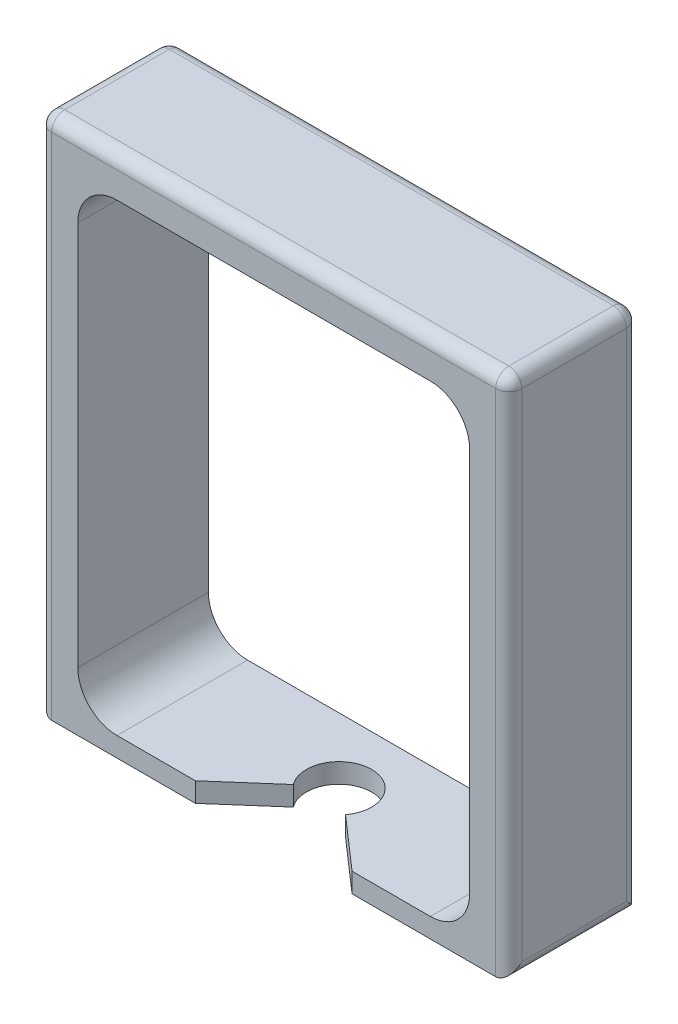
ISO-10303-21;
HEADER;
FILE_DESCRIPTION(('STEP AP214'),'2;1');
FILE_NAME('part.step','',(''),(''),'','','');
FILE_SCHEMA(('AUTOMOTIVE_DESIGN { 1 0 10303 214 1 1 1 1 }'));
ENDSEC;
DATA;
#1=APPLICATION_CONTEXT('core data for automotive mechanical design processes');
#2=APPLICATION_PROTOCOL_DEFINITION('international standard','automotive_design',2000,#1);
#3=PRODUCT_CONTEXT('',#1,'mechanical');
#4=PRODUCT('Part','Part','',(#3));
#5=PRODUCT_RELATED_PRODUCT_CATEGORY('part','',(#4));
#6=PRODUCT_DEFINITION_FORMATION('','',#4);
#7=PRODUCT_DEFINITION_CONTEXT('part definition',#1,'design');
#8=PRODUCT_DEFINITION('design','',#6,#7);
#9=PRODUCT_DEFINITION_SHAPE('','',#8);
#10=(LENGTH_UNIT() NAMED_UNIT(*) SI_UNIT(.MILLI.,.METRE.));
#11=(NAMED_UNIT(*) PLANE_ANGLE_UNIT() SI_UNIT($,.RADIAN.));
#12=(NAMED_UNIT(*) SI_UNIT($,.STERADIAN.) SOLID_ANGLE_UNIT());
#13=UNCERTAINTY_MEASURE_WITH_UNIT(LENGTH_MEASURE(1.E-05),#10,'distance_accuracy_value','');
#14=(GEOMETRIC_REPRESENTATION_CONTEXT(3) GLOBAL_UNCERTAINTY_ASSIGNED_CONTEXT((#13)) GLOBAL_UNIT_ASSIGNED_CONTEXT((#10,
#11,#12)) REPRESENTATION_CONTEXT('',''));
#15=CARTESIAN_POINT('',(0.,0.,0.));
#16=DIRECTION('',(0.,0.,1.));
#17=DIRECTION('',(1.,0.,0.));
#18=AXIS2_PLACEMENT_3D('',#15,#16,#17);
#19=CARTESIAN_POINT('',(0.,0.,10.));
#20=DIRECTION('',(0.,0.,1.));
#21=DIRECTION('',(1.,0.,0.));
#22=AXIS2_PLACEMENT_3D('',#19,#20,#21);
#23=PLANE('',#22);
#24=DIRECTION('',(1.,0.,0.));
#25=VECTOR('',#24,1.);
#26=CARTESIAN_POINT('',(-18.,-20.,10.));
#27=LINE('',#26,#25);
#28=CARTESIAN_POINT('',(6.,-20.,10.));
#29=VERTEX_POINT('',#28);
#30=CARTESIAN_POINT('',(17.,-20.,10.));
#31=VERTEX_POINT('',#30);
#32=EDGE_CURVE('E201',#29,#31,#27,.T.);
#33=ORIENTED_EDGE('',*,*,#32,.T.);
#34=DIRECTION('',(0.,1.,0.));
#35=VECTOR('',#34,1.);
#36=CARTESIAN_POINT('',(17.,20.,10.));
#37=LINE('',#36,#35);
#38=CARTESIAN_POINT('',(17.,19.,10.));
#39=VERTEX_POINT('',#38);
#40=EDGE_CURVE('E284',#31,#39,#37,.T.);
#41=ORIENTED_EDGE('',*,*,#40,.T.);
#42=DIRECTION('',(-1.,0.,0.));
#43=VECTOR('',#42,1.);
#44=CARTESIAN_POINT('',(-18.,19.,10.));
#45=LINE('',#44,#43);
#46=CARTESIAN_POINT('',(-17.,19.,10.));
#47=VERTEX_POINT('',#46);
#48=EDGE_CURVE('E280',#39,#47,#45,.T.);
#49=ORIENTED_EDGE('',*,*,#48,.T.);
#50=DIRECTION('',(0.,-1.,0.));
#51=VECTOR('',#50,1.);
#52=CARTESIAN_POINT('',(-17.,-20.,10.));
#53=LINE('',#52,#51);
#54=CARTESIAN_POINT('',(-17.,-20.,10.));
#55=VERTEX_POINT('',#54);
#56=EDGE_CURVE('E282',#47,#55,#53,.T.);
#57=ORIENTED_EDGE('',*,*,#56,.T.);
#58=CARTESIAN_POINT('',(-6.,-20.,10.));
#59=VERTEX_POINT('',#58);
#60=EDGE_CURVE('E213',#55,#59,#27,.T.);
#61=ORIENTED_EDGE('',*,*,#60,.T.);
#62=DIRECTION('',(0.,-1.,0.));
#63=VECTOR('',#62,1.);
#64=CARTESIAN_POINT('',(-6.,20.001,10.));
#65=LINE('',#64,#63);
#66=CARTESIAN_POINT('',(-6.,-18.5,10.));
#67=VERTEX_POINT('',#66);
#68=EDGE_CURVE('E339',#67,#59,#65,.T.);
#69=ORIENTED_EDGE('',*,*,#68,.F.);
#70=DIRECTION('',(1.,0.,0.));
#71=VECTOR('',#70,1.);
#72=CARTESIAN_POINT('',(-15.,-18.5,10.));
#73=LINE('',#72,#71);
#74=CARTESIAN_POINT('',(-12.,-18.5,10.));
#75=VERTEX_POINT('',#74);
#76=EDGE_CURVE('E358',#75,#67,#73,.T.);
#77=ORIENTED_EDGE('',*,*,#76,.F.);
#78=CARTESIAN_POINT('',(-12.,-15.5,10.));
#79=DIRECTION('',(0.,0.,1.));
#80=DIRECTION('',(1.,0.,0.));
#81=AXIS2_PLACEMENT_3D('',#78,#79,#80);
#82=CIRCLE('',#81,3.);
#83=CARTESIAN_POINT('',(-15.,-15.5,10.));
#84=VERTEX_POINT('',#83);
#85=EDGE_CURVE('E256',#75,#84,#82,.F.);
#86=ORIENTED_EDGE('',*,*,#85,.T.);
#87=DIRECTION('',(0.,-1.,0.));
#88=VECTOR('',#87,1.);
#89=CARTESIAN_POINT('',(-15.,17.,10.));
#90=LINE('',#89,#88);
#91=CARTESIAN_POINT('',(-15.,14.,10.));
#92=VERTEX_POINT('',#91);
#93=EDGE_CURVE('E355',#92,#84,#90,.T.);
#94=ORIENTED_EDGE('',*,*,#93,.F.);
#95=CARTESIAN_POINT('',(-12.,14.,10.));
#96=DIRECTION('',(0.,0.,1.));
#97=DIRECTION('',(1.,0.,0.));
#98=AXIS2_PLACEMENT_3D('',#95,#96,#97);
#99=CIRCLE('',#98,3.);
#100=CARTESIAN_POINT('',(-12.,17.,10.));
#101=VERTEX_POINT('',#100);
#102=EDGE_CURVE('E248',#92,#101,#99,.F.);
#103=ORIENTED_EDGE('',*,*,#102,.T.);
#104=DIRECTION('',(-1.,0.,0.));
#105=VECTOR('',#104,1.);
#106=CARTESIAN_POINT('',(-15.,17.,10.));
#107=LINE('',#106,#105);
#108=CARTESIAN_POINT('',(12.,17.,10.));
#109=VERTEX_POINT('',#108);
#110=EDGE_CURVE('E217',#109,#101,#107,.T.);
#111=ORIENTED_EDGE('',*,*,#110,.F.);
#112=CARTESIAN_POINT('',(12.,14.,10.));
#113=DIRECTION('',(0.,0.,1.));
#114=DIRECTION('',(1.,0.,0.));
#115=AXIS2_PLACEMENT_3D('',#112,#113,#114);
#116=CIRCLE('',#115,3.);
#117=CARTESIAN_POINT('',(15.,14.,10.));
#118=VERTEX_POINT('',#117);
#119=EDGE_CURVE('E244',#109,#118,#116,.F.);
#120=ORIENTED_EDGE('',*,*,#119,.T.);
#121=DIRECTION('',(0.,1.,0.));
#122=VECTOR('',#121,1.);
#123=CARTESIAN_POINT('',(15.,17.,10.));
#124=LINE('',#123,#122);
#125=CARTESIAN_POINT('',(15.,-15.5,10.));
#126=VERTEX_POINT('',#125);
#127=EDGE_CURVE('E360',#126,#118,#124,.T.);
#128=ORIENTED_EDGE('',*,*,#127,.F.);
#129=CARTESIAN_POINT('',(12.,-15.5,10.));
#130=DIRECTION('',(0.,0.,1.));
#131=DIRECTION('',(1.,0.,0.));
#132=AXIS2_PLACEMENT_3D('',#129,#130,#131);
#133=CIRCLE('',#132,3.);
#134=CARTESIAN_POINT('',(12.,-18.5,10.));
#135=VERTEX_POINT('',#134);
#136=EDGE_CURVE('E252',#126,#135,#133,.F.);
#137=ORIENTED_EDGE('',*,*,#136,.T.);
#138=CARTESIAN_POINT('',(6.,-18.5,10.));
#139=VERTEX_POINT('',#138);
#140=EDGE_CURVE('E204',#139,#135,#73,.T.);
#141=ORIENTED_EDGE('',*,*,#140,.F.);
#142=DIRECTION('',(0.,-1.,0.));
#143=VECTOR('',#142,1.);
#144=CARTESIAN_POINT('',(6.,20.001,10.));
#145=LINE('',#144,#143);
#146=EDGE_CURVE('E187',#139,#29,#145,.T.);
#147=ORIENTED_EDGE('',*,*,#146,.T.);
#148=EDGE_LOOP('',(#33,#41,#49,#57,#61,#69,#77,#86,#94,#103,#111,#120,#128,#137,#141,#147));
#149=FACE_BOUND('',#148,.T.);
#150=ADVANCED_FACE('F33',(#149),#23,.T.);
#151=CARTESIAN_POINT('',(0.,0.,0.));
#152=DIRECTION('',(0.,0.,1.));
#153=DIRECTION('',(1.,0.,0.));
#154=AXIS2_PLACEMENT_3D('',#151,#152,#153);
#155=PLANE('',#154);
#156=DIRECTION('',(-1.,0.,0.));
#157=VECTOR('',#156,1.);
#158=CARTESIAN_POINT('',(0.,19.,0.));
#159=LINE('',#158,#157);
#160=CARTESIAN_POINT('',(-17.,19.,0.));
#161=VERTEX_POINT('',#160);
#162=CARTESIAN_POINT('',(17.,19.,0.));
#163=VERTEX_POINT('',#162);
#164=EDGE_CURVE('E286',#161,#163,#159,.F.);
#165=ORIENTED_EDGE('',*,*,#164,.T.);
#166=DIRECTION('',(0.,1.,0.));
#167=VECTOR('',#166,1.);
#168=CARTESIAN_POINT('',(17.,0.,0.));
#169=LINE('',#168,#167);
#170=CARTESIAN_POINT('',(17.,-20.,0.));
#171=VERTEX_POINT('',#170);
#172=EDGE_CURVE('E290',#163,#171,#169,.F.);
#173=ORIENTED_EDGE('',*,*,#172,.T.);
#174=DIRECTION('',(1.,0.,0.));
#175=VECTOR('',#174,1.);
#176=CARTESIAN_POINT('',(-18.,-20.,0.));
#177=LINE('',#176,#175);
#178=CARTESIAN_POINT('',(-17.,-20.,0.));
#179=VERTEX_POINT('',#178);
#180=EDGE_CURVE('E214',#179,#171,#177,.T.);
#181=ORIENTED_EDGE('',*,*,#180,.F.);
#182=DIRECTION('',(0.,-1.,0.));
#183=VECTOR('',#182,1.);
#184=CARTESIAN_POINT('',(-17.,0.,0.));
#185=LINE('',#184,#183);
#186=EDGE_CURVE('E288',#179,#161,#185,.F.);
#187=ORIENTED_EDGE('',*,*,#186,.T.);
#188=EDGE_LOOP('',(#165,#173,#181,#187));
#189=FACE_BOUND('',#188,.T.);
#190=DIRECTION('',(-1.,0.,0.));
#191=VECTOR('',#190,1.);
#192=CARTESIAN_POINT('',(-15.,17.,0.));
#193=LINE('',#192,#191);
#194=CARTESIAN_POINT('',(12.,17.,0.));
#195=VERTEX_POINT('',#194);
#196=CARTESIAN_POINT('',(-12.,17.,0.));
#197=VERTEX_POINT('',#196);
#198=EDGE_CURVE('E220',#195,#197,#193,.T.);
#199=ORIENTED_EDGE('',*,*,#198,.T.);
#200=CARTESIAN_POINT('',(-12.,14.,0.));
#201=DIRECTION('',(0.,0.,1.));
#202=DIRECTION('',(1.,0.,0.));
#203=AXIS2_PLACEMENT_3D('',#200,#201,#202);
#204=CIRCLE('',#203,3.);
#205=CARTESIAN_POINT('',(-15.,14.,0.));
#206=VERTEX_POINT('',#205);
#207=EDGE_CURVE('E246',#197,#206,#204,.T.);
#208=ORIENTED_EDGE('',*,*,#207,.T.);
#209=DIRECTION('',(0.,-1.,0.));
#210=VECTOR('',#209,1.);
#211=CARTESIAN_POINT('',(-15.,17.,0.));
#212=LINE('',#211,#210);
#213=CARTESIAN_POINT('',(-15.,-15.5,0.));
#214=VERTEX_POINT('',#213);
#215=EDGE_CURVE('E195',#206,#214,#212,.T.);
#216=ORIENTED_EDGE('',*,*,#215,.T.);
#217=CARTESIAN_POINT('',(-12.,-15.5,0.));
#218=DIRECTION('',(0.,0.,1.));
#219=DIRECTION('',(1.,0.,0.));
#220=AXIS2_PLACEMENT_3D('',#217,#218,#219);
#221=CIRCLE('',#220,3.);
#222=CARTESIAN_POINT('',(-12.,-18.5,0.));
#223=VERTEX_POINT('',#222);
#224=EDGE_CURVE('E254',#214,#223,#221,.T.);
#225=ORIENTED_EDGE('',*,*,#224,.T.);
#226=DIRECTION('',(1.,0.,0.));
#227=VECTOR('',#226,1.);
#228=CARTESIAN_POINT('',(-15.,-18.5,0.));
#229=LINE('',#228,#227);
#230=CARTESIAN_POINT('',(12.,-18.5,0.));
#231=VERTEX_POINT('',#230);
#232=EDGE_CURVE('E367',#223,#231,#229,.T.);
#233=ORIENTED_EDGE('',*,*,#232,.T.);
#234=CARTESIAN_POINT('',(12.,-15.5,0.));
#235=DIRECTION('',(0.,0.,1.));
#236=DIRECTION('',(1.,0.,0.));
#237=AXIS2_PLACEMENT_3D('',#234,#235,#236);
#238=CIRCLE('',#237,3.);
#239=CARTESIAN_POINT('',(15.,-15.5,0.));
#240=VERTEX_POINT('',#239);
#241=EDGE_CURVE('E250',#231,#240,#238,.T.);
#242=ORIENTED_EDGE('',*,*,#241,.T.);
#243=DIRECTION('',(0.,1.,0.));
#244=VECTOR('',#243,1.);
#245=CARTESIAN_POINT('',(15.,17.,0.));
#246=LINE('',#245,#244);
#247=CARTESIAN_POINT('',(15.,14.,0.));
#248=VERTEX_POINT('',#247);
#249=EDGE_CURVE('E369',#240,#248,#246,.T.);
#250=ORIENTED_EDGE('',*,*,#249,.T.);
#251=CARTESIAN_POINT('',(12.,14.,0.));
#252=DIRECTION('',(0.,0.,1.));
#253=DIRECTION('',(1.,0.,0.));
#254=AXIS2_PLACEMENT_3D('',#251,#252,#253);
#255=CIRCLE('',#254,3.);
#256=EDGE_CURVE('E242',#248,#195,#255,.T.);
#257=ORIENTED_EDGE('',*,*,#256,.T.);
#258=EDGE_LOOP('',(#199,#208,#216,#225,#233,#242,#250,#257));
#259=FACE_BOUND('',#258,.T.);
#260=ADVANCED_FACE('F375',(#189,#259),#155,.F.);
#261=CARTESIAN_POINT('',(-18.,20.,10.));
#262=DIRECTION('',(1.,0.,0.));
#263=DIRECTION('',(0.,0.,-1.));
#264=AXIS2_PLACEMENT_3D('',#261,#262,#263);
#265=PLANE('',#264);
#266=DIRECTION('',(0.,-1.,0.));
#267=VECTOR('',#266,1.);
#268=CARTESIAN_POINT('',(-18.,20.,0.999999999999999));
#269=LINE('',#268,#267);
#270=CARTESIAN_POINT('',(-18.,19.,0.999999999999999));
#271=VERTEX_POINT('',#270);
#272=CARTESIAN_POINT('',(-18.,-19.,0.999999999999999));
#273=VERTEX_POINT('',#272);
#274=EDGE_CURVE('E266',#271,#273,#269,.T.);
#275=ORIENTED_EDGE('',*,*,#274,.T.);
#276=DIRECTION('',(0.,0.,-1.));
#277=VECTOR('',#276,1.);
#278=CARTESIAN_POINT('',(-18.,-19.,10.));
#279=LINE('',#278,#277);
#280=CARTESIAN_POINT('',(-18.,-19.,9.));
#281=VERTEX_POINT('',#280);
#282=EDGE_CURVE('E268',#273,#281,#279,.F.);
#283=ORIENTED_EDGE('',*,*,#282,.T.);
#284=DIRECTION('',(0.,-1.,0.));
#285=VECTOR('',#284,1.);
#286=CARTESIAN_POINT('',(-18.,20.,9.));
#287=LINE('',#286,#285);
#288=CARTESIAN_POINT('',(-18.,19.,9.));
#289=VERTEX_POINT('',#288);
#290=EDGE_CURVE('E264',#281,#289,#287,.F.);
#291=ORIENTED_EDGE('',*,*,#290,.T.);
#292=DIRECTION('',(0.,0.,-1.));
#293=VECTOR('',#292,1.);
#294=CARTESIAN_POINT('',(-18.,19.,10.));
#295=LINE('',#294,#293);
#296=EDGE_CURVE('E262',#289,#271,#295,.T.);
#297=ORIENTED_EDGE('',*,*,#296,.T.);
#298=EDGE_LOOP('',(#275,#283,#291,#297));
#299=FACE_BOUND('',#298,.T.);
#300=ADVANCED_FACE('F434',(#299),#265,.F.);
#301=CARTESIAN_POINT('',(-18.,-20.,10.));
#302=DIRECTION('',(0.,1.,0.));
#303=DIRECTION('',(0.,0.,1.));
#304=AXIS2_PLACEMENT_3D('',#301,#302,#303);
#305=PLANE('',#304);
#306=ORIENTED_EDGE('',*,*,#60,.F.);
#307=DIRECTION('',(0.,0.,-1.));
#308=VECTOR('',#307,1.);
#309=CARTESIAN_POINT('',(-17.,-20.,10.));
#310=LINE('',#309,#308);
#311=EDGE_CURVE('E259',#55,#179,#310,.T.);
#312=ORIENTED_EDGE('',*,*,#311,.T.);
#313=ORIENTED_EDGE('',*,*,#180,.T.);
#314=DIRECTION('',(0.,0.,-1.));
#315=VECTOR('',#314,1.);
#316=CARTESIAN_POINT('',(17.,-20.,10.));
#317=LINE('',#316,#315);
#318=EDGE_CURVE('E212',#171,#31,#317,.F.);
#319=ORIENTED_EDGE('',*,*,#318,.T.);
#320=ORIENTED_EDGE('',*,*,#32,.F.);
#321=DIRECTION('',(0.752576694706878,0.,0.658504607868518));
#322=VECTOR('',#321,1.);
#323=CARTESIAN_POINT('',(6.,-20.,10.));
#324=LINE('',#323,#322);
#325=CARTESIAN_POINT('',(2.,-20.,6.5));
#326=VERTEX_POINT('',#325);
#327=EDGE_CURVE('E184',#326,#29,#324,.T.);
#328=ORIENTED_EDGE('',*,*,#327,.F.);
#329=CARTESIAN_POINT('',(0.,-20.,5.));
#330=DIRECTION('',(0.,-1.,0.));
#331=DIRECTION('',(0.,0.,-1.));
#332=AXIS2_PLACEMENT_3D('',#329,#330,#331);
#333=CIRCLE('',#332,2.5);
#334=CARTESIAN_POINT('',(-2.,-20.,6.5));
#335=VERTEX_POINT('',#334);
#336=EDGE_CURVE('E196',#335,#326,#333,.T.);
#337=ORIENTED_EDGE('',*,*,#336,.F.);
#338=DIRECTION('',(0.752576694706878,0.,-0.658504607868518));
#339=VECTOR('',#338,1.);
#340=CARTESIAN_POINT('',(-6.,-20.,10.));
#341=LINE('',#340,#339);
#342=EDGE_CURVE('E406',#59,#335,#341,.T.);
#343=ORIENTED_EDGE('',*,*,#342,.F.);
#344=EDGE_LOOP('',(#306,#312,#313,#319,#320,#328,#337,#343));
#345=FACE_BOUND('',#344,.T.);
#346=ADVANCED_FACE('F209',(#345),#305,.F.);
#347=CARTESIAN_POINT('',(18.,20.,10.));
#348=DIRECTION('',(-1.,0.,0.));
#349=DIRECTION('',(0.,0.,1.));
#350=AXIS2_PLACEMENT_3D('',#347,#348,#349);
#351=PLANE('',#350);
#352=DIRECTION('',(0.,1.,0.));
#353=VECTOR('',#352,1.);
#354=CARTESIAN_POINT('',(18.,-20.,9.));
#355=LINE('',#354,#353);
#356=CARTESIAN_POINT('',(18.,19.,9.));
#357=VERTEX_POINT('',#356);
#358=CARTESIAN_POINT('',(18.,-19.,9.));
#359=VERTEX_POINT('',#358);
#360=EDGE_CURVE('E275',#357,#359,#355,.F.);
#361=ORIENTED_EDGE('',*,*,#360,.T.);
#362=DIRECTION('',(0.,0.,-1.));
#363=VECTOR('',#362,1.);
#364=CARTESIAN_POINT('',(18.,-19.,10.));
#365=LINE('',#364,#363);
#366=CARTESIAN_POINT('',(18.,-19.,0.999999999999999));
#367=VERTEX_POINT('',#366);
#368=EDGE_CURVE('E277',#359,#367,#365,.T.);
#369=ORIENTED_EDGE('',*,*,#368,.T.);
#370=DIRECTION('',(0.,1.,0.));
#371=VECTOR('',#370,1.);
#372=CARTESIAN_POINT('',(18.,20.,0.999999999999999));
#373=LINE('',#372,#371);
#374=CARTESIAN_POINT('',(18.,19.,0.999999999999999));
#375=VERTEX_POINT('',#374);
#376=EDGE_CURVE('E273',#367,#375,#373,.T.);
#377=ORIENTED_EDGE('',*,*,#376,.T.);
#378=DIRECTION('',(0.,0.,-1.));
#379=VECTOR('',#378,1.);
#380=CARTESIAN_POINT('',(18.,19.,10.));
#381=LINE('',#380,#379);
#382=EDGE_CURVE('E271',#375,#357,#381,.F.);
#383=ORIENTED_EDGE('',*,*,#382,.T.);
#384=EDGE_LOOP('',(#361,#369,#377,#383));
#385=FACE_BOUND('',#384,.T.);
#386=ADVANCED_FACE('F482',(#385),#351,.F.);
#387=CARTESIAN_POINT('',(-18.,20.,10.));
#388=DIRECTION('',(0.,-1.,0.));
#389=DIRECTION('',(1.,0.,0.));
#390=AXIS2_PLACEMENT_3D('',#387,#388,#389);
#391=PLANE('',#390);
#392=DIRECTION('',(-1.,0.,0.));
#393=VECTOR('',#392,1.);
#394=CARTESIAN_POINT('',(-18.,20.,0.999999999999999));
#395=LINE('',#394,#393);
#396=CARTESIAN_POINT('',(17.,20.,0.999999999999999));
#397=VERTEX_POINT('',#396);
#398=CARTESIAN_POINT('',(-17.,20.,0.999999999999999));
#399=VERTEX_POINT('',#398);
#400=EDGE_CURVE('E42',#397,#399,#395,.T.);
#401=ORIENTED_EDGE('',*,*,#400,.T.);
#402=DIRECTION('',(0.,0.,-1.));
#403=VECTOR('',#402,1.);
#404=CARTESIAN_POINT('',(-17.,20.,10.));
#405=LINE('',#404,#403);
#406=CARTESIAN_POINT('',(-17.,20.,9.));
#407=VERTEX_POINT('',#406);
#408=EDGE_CURVE('E11',#399,#407,#405,.F.);
#409=ORIENTED_EDGE('',*,*,#408,.T.);
#410=DIRECTION('',(-1.,0.,0.));
#411=VECTOR('',#410,1.);
#412=CARTESIAN_POINT('',(18.,20.,9.));
#413=LINE('',#412,#411);
#414=CARTESIAN_POINT('',(17.,20.,9.));
#415=VERTEX_POINT('',#414);
#416=EDGE_CURVE('E294',#407,#415,#413,.F.);
#417=ORIENTED_EDGE('',*,*,#416,.T.);
#418=DIRECTION('',(0.,0.,-1.));
#419=VECTOR('',#418,1.);
#420=CARTESIAN_POINT('',(17.,20.,10.));
#421=LINE('',#420,#419);
#422=EDGE_CURVE('E292',#415,#397,#421,.T.);
#423=ORIENTED_EDGE('',*,*,#422,.T.);
#424=EDGE_LOOP('',(#401,#409,#417,#423));
#425=FACE_BOUND('',#424,.T.);
#426=ADVANCED_FACE('F439',(#425),#391,.F.);
#427=CARTESIAN_POINT('',(-15.,17.,10.));
#428=DIRECTION('',(1.,0.,0.));
#429=DIRECTION('',(0.,1.,0.));
#430=AXIS2_PLACEMENT_3D('',#427,#428,#429);
#431=PLANE('',#430);
#432=ORIENTED_EDGE('',*,*,#215,.F.);
#433=DIRECTION('',(0.,0.,-1.));
#434=VECTOR('',#433,1.);
#435=CARTESIAN_POINT('',(-15.,14.,10.));
#436=LINE('',#435,#434);
#437=EDGE_CURVE('E235',#206,#92,#436,.F.);
#438=ORIENTED_EDGE('',*,*,#437,.T.);
#439=ORIENTED_EDGE('',*,*,#93,.T.);
#440=DIRECTION('',(0.,0.,-1.));
#441=VECTOR('',#440,1.);
#442=CARTESIAN_POINT('',(-15.,-15.5,0.));
#443=LINE('',#442,#441);
#444=EDGE_CURVE('E232',#84,#214,#443,.T.);
#445=ORIENTED_EDGE('',*,*,#444,.T.);
#446=EDGE_LOOP('',(#432,#438,#439,#445));
#447=FACE_BOUND('',#446,.T.);
#448=ADVANCED_FACE('F477',(#447),#431,.T.);
#449=CARTESIAN_POINT('',(-15.,-18.5,10.));
#450=DIRECTION('',(0.,1.,0.));
#451=DIRECTION('',(0.,0.,1.));
#452=AXIS2_PLACEMENT_3D('',#449,#450,#451);
#453=PLANE('',#452);
#454=ORIENTED_EDGE('',*,*,#140,.T.);
#455=DIRECTION('',(0.,0.,-1.));
#456=VECTOR('',#455,1.);
#457=CARTESIAN_POINT('',(12.,-18.5,0.));
#458=LINE('',#457,#456);
#459=EDGE_CURVE('E239',#135,#231,#458,.T.);
#460=ORIENTED_EDGE('',*,*,#459,.T.);
#461=ORIENTED_EDGE('',*,*,#232,.F.);
#462=DIRECTION('',(0.,0.,-1.));
#463=VECTOR('',#462,1.);
#464=CARTESIAN_POINT('',(-12.,-18.5,10.));
#465=LINE('',#464,#463);
#466=EDGE_CURVE('E237',#223,#75,#465,.F.);
#467=ORIENTED_EDGE('',*,*,#466,.T.);
#468=ORIENTED_EDGE('',*,*,#76,.T.);
#469=DIRECTION('',(0.752576694706878,0.,-0.658504607868518));
#470=VECTOR('',#469,1.);
#471=CARTESIAN_POINT('',(-6.,-18.5,10.));
#472=LINE('',#471,#470);
#473=CARTESIAN_POINT('',(-2.,-18.5,6.5));
#474=VERTEX_POINT('',#473);
#475=EDGE_CURVE('E402',#67,#474,#472,.T.);
#476=ORIENTED_EDGE('',*,*,#475,.T.);
#477=CARTESIAN_POINT('',(0.,-18.5,5.));
#478=DIRECTION('',(0.,1.,0.));
#479=DIRECTION('',(0.,0.,1.));
#480=AXIS2_PLACEMENT_3D('',#477,#478,#479);
#481=CIRCLE('',#480,2.5);
#482=CARTESIAN_POINT('',(2.,-18.5,6.5));
#483=VERTEX_POINT('',#482);
#484=EDGE_CURVE('E205',#474,#483,#481,.F.);
#485=ORIENTED_EDGE('',*,*,#484,.T.);
#486=DIRECTION('',(0.752576694706878,0.,0.658504607868518));
#487=VECTOR('',#486,1.);
#488=CARTESIAN_POINT('',(6.,-18.5,10.));
#489=LINE('',#488,#487);
#490=EDGE_CURVE('E206',#483,#139,#489,.T.);
#491=ORIENTED_EDGE('',*,*,#490,.T.);
#492=EDGE_LOOP('',(#454,#460,#461,#467,#468,#476,#485,#491));
#493=FACE_BOUND('',#492,.T.);
#494=ADVANCED_FACE('F395',(#493),#453,.T.);
#495=CARTESIAN_POINT('',(15.,17.,10.));
#496=DIRECTION('',(-1.,0.,0.));
#497=DIRECTION('',(0.,-1.,0.));
#498=AXIS2_PLACEMENT_3D('',#495,#496,#497);
#499=PLANE('',#498);
#500=ORIENTED_EDGE('',*,*,#127,.T.);
#501=DIRECTION('',(0.,0.,-1.));
#502=VECTOR('',#501,1.);
#503=CARTESIAN_POINT('',(15.,14.,0.));
#504=LINE('',#503,#502);
#505=EDGE_CURVE('E224',#118,#248,#504,.T.);
#506=ORIENTED_EDGE('',*,*,#505,.T.);
#507=ORIENTED_EDGE('',*,*,#249,.F.);
#508=DIRECTION('',(0.,0.,-1.));
#509=VECTOR('',#508,1.);
#510=CARTESIAN_POINT('',(15.,-15.5,10.));
#511=LINE('',#510,#509);
#512=EDGE_CURVE('E216',#240,#126,#511,.F.);
#513=ORIENTED_EDGE('',*,*,#512,.T.);
#514=EDGE_LOOP('',(#500,#506,#507,#513));
#515=FACE_BOUND('',#514,.T.);
#516=ADVANCED_FACE('F389',(#515),#499,.T.);
#517=CARTESIAN_POINT('',(-15.,17.,10.));
#518=DIRECTION('',(0.,-1.,0.));
#519=DIRECTION('',(0.,0.,-1.));
#520=AXIS2_PLACEMENT_3D('',#517,#518,#519);
#521=PLANE('',#520);
#522=ORIENTED_EDGE('',*,*,#198,.F.);
#523=DIRECTION('',(0.,0.,-1.));
#524=VECTOR('',#523,1.);
#525=CARTESIAN_POINT('',(12.,17.,10.));
#526=LINE('',#525,#524);
#527=EDGE_CURVE('E230',#195,#109,#526,.F.);
#528=ORIENTED_EDGE('',*,*,#527,.T.);
#529=ORIENTED_EDGE('',*,*,#110,.T.);
#530=DIRECTION('',(0.,0.,-1.));
#531=VECTOR('',#530,1.);
#532=CARTESIAN_POINT('',(-12.,17.,0.));
#533=LINE('',#532,#531);
#534=EDGE_CURVE('E227',#101,#197,#533,.T.);
#535=ORIENTED_EDGE('',*,*,#534,.T.);
#536=EDGE_LOOP('',(#522,#528,#529,#535));
#537=FACE_BOUND('',#536,.T.);
#538=ADVANCED_FACE('F379',(#537),#521,.T.);
#539=CARTESIAN_POINT('',(6.,20.001,10.));
#540=DIRECTION('',(0.658504607868518,0.,-0.752576694706878));
#541=DIRECTION('',(-0.752576694706878,0.,-0.658504607868518));
#542=AXIS2_PLACEMENT_3D('',#539,#540,#541);
#543=PLANE('',#542);
#544=DIRECTION('',(0.,-1.,0.));
#545=VECTOR('',#544,1.);
#546=CARTESIAN_POINT('',(2.,20.001,6.5));
#547=LINE('',#546,#545);
#548=EDGE_CURVE('E190',#483,#326,#547,.T.);
#549=ORIENTED_EDGE('',*,*,#548,.T.);
#550=ORIENTED_EDGE('',*,*,#327,.T.);
#551=ORIENTED_EDGE('',*,*,#146,.F.);
#552=ORIENTED_EDGE('',*,*,#490,.F.);
#553=EDGE_LOOP('',(#549,#550,#551,#552));
#554=FACE_BOUND('',#553,.T.);
#555=ADVANCED_FACE('F186',(#554),#543,.F.);
#556=CARTESIAN_POINT('',(0.,20.001,5.));
#557=DIRECTION('',(0.,-1.,0.));
#558=DIRECTION('',(0.,0.,-1.));
#559=AXIS2_PLACEMENT_3D('',#556,#557,#558);
#560=CYLINDRICAL_SURFACE('',#559,2.5);
#561=DIRECTION('',(0.,-1.,0.));
#562=VECTOR('',#561,1.);
#563=CARTESIAN_POINT('',(-2.,20.001,6.5));
#564=LINE('',#563,#562);
#565=EDGE_CURVE('E353',#474,#335,#564,.T.);
#566=ORIENTED_EDGE('',*,*,#565,.T.);
#567=ORIENTED_EDGE('',*,*,#336,.T.);
#568=ORIENTED_EDGE('',*,*,#548,.F.);
#569=ORIENTED_EDGE('',*,*,#484,.F.);
#570=EDGE_LOOP('',(#566,#567,#568,#569));
#571=FACE_BOUND('',#570,.T.);
#572=ADVANCED_FACE('F401',(#571),#560,.F.);
#573=CARTESIAN_POINT('',(-6.,20.001,10.));
#574=DIRECTION('',(-0.658504607868518,0.,-0.752576694706878));
#575=DIRECTION('',(-0.752576694706878,0.,0.658504607868518));
#576=AXIS2_PLACEMENT_3D('',#573,#574,#575);
#577=PLANE('',#576);
#578=ORIENTED_EDGE('',*,*,#68,.T.);
#579=ORIENTED_EDGE('',*,*,#342,.T.);
#580=ORIENTED_EDGE('',*,*,#565,.F.);
#581=ORIENTED_EDGE('',*,*,#475,.F.);
#582=EDGE_LOOP('',(#578,#579,#580,#581));
#583=FACE_BOUND('',#582,.T.);
#584=ADVANCED_FACE('F408',(#583),#577,.F.);
#585=CARTESIAN_POINT('',(12.,14.,10.));
#586=DIRECTION('',(0.,0.,1.));
#587=DIRECTION('',(1.,0.,0.));
#588=AXIS2_PLACEMENT_3D('',#585,#586,#587);
#589=CYLINDRICAL_SURFACE('',#588,3.);
#590=ORIENTED_EDGE('',*,*,#119,.F.);
#591=ORIENTED_EDGE('',*,*,#527,.F.);
#592=ORIENTED_EDGE('',*,*,#256,.F.);
#593=ORIENTED_EDGE('',*,*,#505,.F.);
#594=EDGE_LOOP('',(#590,#591,#592,#593));
#595=FACE_BOUND('',#594,.T.);
#596=ADVANCED_FACE('F384',(#595),#589,.F.);
#597=CARTESIAN_POINT('',(-12.,14.,10.));
#598=DIRECTION('',(0.,0.,1.));
#599=DIRECTION('',(1.,0.,0.));
#600=AXIS2_PLACEMENT_3D('',#597,#598,#599);
#601=CYLINDRICAL_SURFACE('',#600,3.);
#602=ORIENTED_EDGE('',*,*,#102,.F.);
#603=ORIENTED_EDGE('',*,*,#437,.F.);
#604=ORIENTED_EDGE('',*,*,#207,.F.);
#605=ORIENTED_EDGE('',*,*,#534,.F.);
#606=EDGE_LOOP('',(#602,#603,#604,#605));
#607=FACE_BOUND('',#606,.T.);
#608=ADVANCED_FACE('F492',(#607),#601,.F.);
#609=CARTESIAN_POINT('',(12.,-15.5,10.));
#610=DIRECTION('',(0.,0.,1.));
#611=DIRECTION('',(1.,0.,0.));
#612=AXIS2_PLACEMENT_3D('',#609,#610,#611);
#613=CYLINDRICAL_SURFACE('',#612,3.);
#614=ORIENTED_EDGE('',*,*,#136,.F.);
#615=ORIENTED_EDGE('',*,*,#512,.F.);
#616=ORIENTED_EDGE('',*,*,#241,.F.);
#617=ORIENTED_EDGE('',*,*,#459,.F.);
#618=EDGE_LOOP('',(#614,#615,#616,#617));
#619=FACE_BOUND('',#618,.T.);
#620=ADVANCED_FACE('F392',(#619),#613,.F.);
#621=CARTESIAN_POINT('',(-12.,-15.5,10.));
#622=DIRECTION('',(0.,0.,1.));
#623=DIRECTION('',(1.,0.,0.));
#624=AXIS2_PLACEMENT_3D('',#621,#622,#623);
#625=CYLINDRICAL_SURFACE('',#624,3.);
#626=ORIENTED_EDGE('',*,*,#85,.F.);
#627=ORIENTED_EDGE('',*,*,#466,.F.);
#628=ORIENTED_EDGE('',*,*,#224,.F.);
#629=ORIENTED_EDGE('',*,*,#444,.F.);
#630=EDGE_LOOP('',(#626,#627,#628,#629));
#631=FACE_BOUND('',#630,.T.);
#632=ADVANCED_FACE('F498',(#631),#625,.F.);
#633=CARTESIAN_POINT('',(17.,-19.,10.));
#634=DIRECTION('',(0.,0.,-1.));
#635=DIRECTION('',(-1.,0.,0.));
#636=AXIS2_PLACEMENT_3D('',#633,#634,#635);
#637=CYLINDRICAL_SURFACE('',#636,1.);
#638=CARTESIAN_POINT('',(17.,-19.,0.999999999999999));
#639=DIRECTION('',(0.,0.707106781186547,-0.707106781186547));
#640=DIRECTION('',(0.,0.707106781186547,0.707106781186547));
#641=AXIS2_PLACEMENT_3D('',#638,#639,#640);
#642=ELLIPSE('',#641,1.41421356237309,1.);
#643=EDGE_CURVE('E333',#367,#171,#642,.T.);
#644=ORIENTED_EDGE('',*,*,#643,.F.);
#645=ORIENTED_EDGE('',*,*,#368,.F.);
#646=CARTESIAN_POINT('',(17.,-19.,9.));
#647=DIRECTION('',(0.,-0.707106781186547,-0.707106781186547));
#648=DIRECTION('',(0.,-0.707106781186547,0.707106781186547));
#649=AXIS2_PLACEMENT_3D('',#646,#647,#648);
#650=ELLIPSE('',#649,1.41421356237309,1.);
#651=EDGE_CURVE('E37',#31,#359,#650,.F.);
#652=ORIENTED_EDGE('',*,*,#651,.F.);
#653=ORIENTED_EDGE('',*,*,#318,.F.);
#654=EDGE_LOOP('',(#644,#645,#652,#653));
#655=FACE_BOUND('',#654,.T.);
#656=ADVANCED_FACE('F35',(#655),#637,.T.);
#657=CARTESIAN_POINT('',(17.,0.,9.));
#658=DIRECTION('',(0.,-1.,0.));
#659=DIRECTION('',(0.,0.,-1.));
#660=AXIS2_PLACEMENT_3D('',#657,#658,#659);
#661=CYLINDRICAL_SURFACE('',#660,1.);
#662=ORIENTED_EDGE('',*,*,#651,.T.);
#663=ORIENTED_EDGE('',*,*,#360,.F.);
#664=CARTESIAN_POINT('',(17.,19.,9.));
#665=DIRECTION('',(0.,1.,0.));
#666=DIRECTION('',(0.,0.,1.));
#667=AXIS2_PLACEMENT_3D('',#664,#665,#666);
#668=CIRCLE('',#667,1.);
#669=EDGE_CURVE('E328',#39,#357,#668,.T.);
#670=ORIENTED_EDGE('',*,*,#669,.F.);
#671=ORIENTED_EDGE('',*,*,#40,.F.);
#672=EDGE_LOOP('',(#662,#663,#670,#671));
#673=FACE_BOUND('',#672,.T.);
#674=ADVANCED_FACE('F453',(#673),#661,.T.);
#675=CARTESIAN_POINT('',(17.,20.,0.999999999999999));
#676=DIRECTION('',(0.,1.,0.));
#677=DIRECTION('',(0.,0.,1.));
#678=AXIS2_PLACEMENT_3D('',#675,#676,#677);
#679=CYLINDRICAL_SURFACE('',#678,1.);
#680=ORIENTED_EDGE('',*,*,#643,.T.);
#681=ORIENTED_EDGE('',*,*,#172,.F.);
#682=CARTESIAN_POINT('',(17.,19.,0.999999999999999));
#683=DIRECTION('',(0.,1.,0.));
#684=DIRECTION('',(0.,0.,1.));
#685=AXIS2_PLACEMENT_3D('',#682,#683,#684);
#686=CIRCLE('',#685,1.);
#687=EDGE_CURVE('E325',#375,#163,#686,.T.);
#688=ORIENTED_EDGE('',*,*,#687,.F.);
#689=ORIENTED_EDGE('',*,*,#376,.F.);
#690=EDGE_LOOP('',(#680,#681,#688,#689));
#691=FACE_BOUND('',#690,.T.);
#692=ADVANCED_FACE('F449',(#691),#679,.T.);
#693=CARTESIAN_POINT('',(17.,19.,10.));
#694=DIRECTION('',(0.,0.,-1.));
#695=DIRECTION('',(-1.,0.,0.));
#696=AXIS2_PLACEMENT_3D('',#693,#694,#695);
#697=CYLINDRICAL_SURFACE('',#696,1.);
#698=CARTESIAN_POINT('',(17.,19.,9.));
#699=DIRECTION('',(0.,0.,1.));
#700=DIRECTION('',(1.,0.,0.));
#701=AXIS2_PLACEMENT_3D('',#698,#699,#700);
#702=CIRCLE('',#701,1.);
#703=EDGE_CURVE('E331',#357,#415,#702,.T.);
#704=ORIENTED_EDGE('',*,*,#703,.F.);
#705=ORIENTED_EDGE('',*,*,#382,.F.);
#706=CARTESIAN_POINT('',(17.,19.,0.999999999999999));
#707=DIRECTION('',(0.,0.,-1.));
#708=DIRECTION('',(-1.,0.,0.));
#709=AXIS2_PLACEMENT_3D('',#706,#707,#708);
#710=CIRCLE('',#709,1.);
#711=EDGE_CURVE('E322',#397,#375,#710,.T.);
#712=ORIENTED_EDGE('',*,*,#711,.F.);
#713=ORIENTED_EDGE('',*,*,#422,.F.);
#714=EDGE_LOOP('',(#704,#705,#712,#713));
#715=FACE_BOUND('',#714,.T.);
#716=ADVANCED_FACE('F445',(#715),#697,.T.);
#717=CARTESIAN_POINT('',(17.,19.,9.));
#718=DIRECTION('',(0.,0.,1.));
#719=DIRECTION('',(1.,0.,0.));
#720=AXIS2_PLACEMENT_3D('',#717,#718,#719);
#721=SPHERICAL_SURFACE('',#720,1.);
#722=ORIENTED_EDGE('',*,*,#669,.T.);
#723=ORIENTED_EDGE('',*,*,#703,.T.);
#724=CARTESIAN_POINT('',(17.,19.,9.));
#725=DIRECTION('',(1.,0.,0.));
#726=DIRECTION('',(0.,0.,-1.));
#727=AXIS2_PLACEMENT_3D('',#724,#725,#726);
#728=CIRCLE('',#727,1.);
#729=EDGE_CURVE('E319',#39,#415,#728,.F.);
#730=ORIENTED_EDGE('',*,*,#729,.F.);
#731=EDGE_LOOP('',(#722,#723,#730));
#732=FACE_BOUND('',#731,.T.);
#733=ADVANCED_FACE('F560',(#732),#721,.T.);
#734=CARTESIAN_POINT('',(17.,19.,1.));
#735=DIRECTION('',(0.,0.,1.));
#736=DIRECTION('',(1.,0.,0.));
#737=AXIS2_PLACEMENT_3D('',#734,#735,#736);
#738=SPHERICAL_SURFACE('',#737,1.);
#739=ORIENTED_EDGE('',*,*,#711,.T.);
#740=ORIENTED_EDGE('',*,*,#687,.T.);
#741=CARTESIAN_POINT('',(17.,19.,1.));
#742=DIRECTION('',(1.,0.,0.));
#743=DIRECTION('',(0.,0.,-1.));
#744=AXIS2_PLACEMENT_3D('',#741,#742,#743);
#745=CIRCLE('',#744,1.);
#746=EDGE_CURVE('E316',#397,#163,#745,.F.);
#747=ORIENTED_EDGE('',*,*,#746,.F.);
#748=EDGE_LOOP('',(#739,#740,#747));
#749=FACE_BOUND('',#748,.T.);
#750=ADVANCED_FACE('F448',(#749),#738,.T.);
#751=CARTESIAN_POINT('',(0.,19.,9.));
#752=DIRECTION('',(1.,0.,0.));
#753=DIRECTION('',(0.,1.,0.));
#754=AXIS2_PLACEMENT_3D('',#751,#752,#753);
#755=CYLINDRICAL_SURFACE('',#754,1.);
#756=ORIENTED_EDGE('',*,*,#729,.T.);
#757=ORIENTED_EDGE('',*,*,#416,.F.);
#758=CARTESIAN_POINT('',(-17.,19.,9.));
#759=DIRECTION('',(-1.,0.,0.));
#760=DIRECTION('',(0.,0.,1.));
#761=AXIS2_PLACEMENT_3D('',#758,#759,#760);
#762=CIRCLE('',#761,1.);
#763=EDGE_CURVE('E310',#47,#407,#762,.T.);
#764=ORIENTED_EDGE('',*,*,#763,.F.);
#765=ORIENTED_EDGE('',*,*,#48,.F.);
#766=EDGE_LOOP('',(#756,#757,#764,#765));
#767=FACE_BOUND('',#766,.T.);
#768=ADVANCED_FACE('F459',(#767),#755,.T.);
#769=CARTESIAN_POINT('',(-18.,19.,0.999999999999999));
#770=DIRECTION('',(-1.,0.,0.));
#771=DIRECTION('',(0.,-1.,0.));
#772=AXIS2_PLACEMENT_3D('',#769,#770,#771);
#773=CYLINDRICAL_SURFACE('',#772,1.);
#774=ORIENTED_EDGE('',*,*,#746,.T.);
#775=ORIENTED_EDGE('',*,*,#164,.F.);
#776=CARTESIAN_POINT('',(-17.,19.,0.999999999999999));
#777=DIRECTION('',(-1.,0.,0.));
#778=DIRECTION('',(0.,0.,1.));
#779=AXIS2_PLACEMENT_3D('',#776,#777,#778);
#780=CIRCLE('',#779,1.);
#781=EDGE_CURVE('E308',#399,#161,#780,.T.);
#782=ORIENTED_EDGE('',*,*,#781,.F.);
#783=ORIENTED_EDGE('',*,*,#400,.F.);
#784=EDGE_LOOP('',(#774,#775,#782,#783));
#785=FACE_BOUND('',#784,.T.);
#786=ADVANCED_FACE('F429',(#785),#773,.T.);
#787=CARTESIAN_POINT('',(-17.,19.,10.));
#788=DIRECTION('',(0.,0.,-1.));
#789=DIRECTION('',(-1.,0.,0.));
#790=AXIS2_PLACEMENT_3D('',#787,#788,#789);
#791=CYLINDRICAL_SURFACE('',#790,1.);
#792=CARTESIAN_POINT('',(-17.,19.,9.));
#793=DIRECTION('',(0.,0.,1.));
#794=DIRECTION('',(1.,0.,0.));
#795=AXIS2_PLACEMENT_3D('',#792,#793,#794);
#796=CIRCLE('',#795,1.);
#797=EDGE_CURVE('E313',#407,#289,#796,.T.);
#798=ORIENTED_EDGE('',*,*,#797,.F.);
#799=ORIENTED_EDGE('',*,*,#408,.F.);
#800=CARTESIAN_POINT('',(-17.,19.,0.999999999999999));
#801=DIRECTION('',(0.,0.,-1.));
#802=DIRECTION('',(-1.,0.,0.));
#803=AXIS2_PLACEMENT_3D('',#800,#801,#802);
#804=CIRCLE('',#803,1.);
#805=EDGE_CURVE('E50',#271,#399,#804,.T.);
#806=ORIENTED_EDGE('',*,*,#805,.F.);
#807=ORIENTED_EDGE('',*,*,#296,.F.);
#808=EDGE_LOOP('',(#798,#799,#806,#807));
#809=FACE_BOUND('',#808,.T.);
#810=ADVANCED_FACE('F438',(#809),#791,.T.);
#811=CARTESIAN_POINT('',(-17.,19.,9.));
#812=DIRECTION('',(0.,0.,1.));
#813=DIRECTION('',(1.,0.,0.));
#814=AXIS2_PLACEMENT_3D('',#811,#812,#813);
#815=SPHERICAL_SURFACE('',#814,1.);
#816=ORIENTED_EDGE('',*,*,#763,.T.);
#817=ORIENTED_EDGE('',*,*,#797,.T.);
#818=CARTESIAN_POINT('',(-17.,19.,9.));
#819=DIRECTION('',(0.,1.,0.));
#820=DIRECTION('',(0.,0.,1.));
#821=AXIS2_PLACEMENT_3D('',#818,#819,#820);
#822=CIRCLE('',#821,1.);
#823=EDGE_CURVE('E304',#47,#289,#822,.F.);
#824=ORIENTED_EDGE('',*,*,#823,.F.);
#825=EDGE_LOOP('',(#816,#817,#824));
#826=FACE_BOUND('',#825,.T.);
#827=ADVANCED_FACE('F461',(#826),#815,.T.);
#828=CARTESIAN_POINT('',(-17.,19.,1.));
#829=DIRECTION('',(0.,0.,1.));
#830=DIRECTION('',(1.,0.,0.));
#831=AXIS2_PLACEMENT_3D('',#828,#829,#830);
#832=SPHERICAL_SURFACE('',#831,1.);
#833=ORIENTED_EDGE('',*,*,#805,.T.);
#834=ORIENTED_EDGE('',*,*,#781,.T.);
#835=CARTESIAN_POINT('',(-17.,19.,1.));
#836=DIRECTION('',(0.,1.,0.));
#837=DIRECTION('',(0.,0.,1.));
#838=AXIS2_PLACEMENT_3D('',#835,#836,#837);
#839=CIRCLE('',#838,1.);
#840=EDGE_CURVE('E301',#271,#161,#839,.F.);
#841=ORIENTED_EDGE('',*,*,#840,.F.);
#842=EDGE_LOOP('',(#833,#834,#841));
#843=FACE_BOUND('',#842,.T.);
#844=ADVANCED_FACE('F432',(#843),#832,.T.);
#845=CARTESIAN_POINT('',(-17.,0.,9.));
#846=DIRECTION('',(0.,1.,0.));
#847=DIRECTION('',(0.,0.,1.));
#848=AXIS2_PLACEMENT_3D('',#845,#846,#847);
#849=CYLINDRICAL_SURFACE('',#848,1.);
#850=ORIENTED_EDGE('',*,*,#823,.T.);
#851=ORIENTED_EDGE('',*,*,#290,.F.);
#852=CARTESIAN_POINT('',(-17.,-19.,9.));
#853=DIRECTION('',(0.,0.707106781186547,0.707106781186547));
#854=DIRECTION('',(0.,0.707106781186547,-0.707106781186547));
#855=AXIS2_PLACEMENT_3D('',#852,#853,#854);
#856=ELLIPSE('',#855,1.41421356237309,1.);
#857=EDGE_CURVE('E299',#55,#281,#856,.F.);
#858=ORIENTED_EDGE('',*,*,#857,.F.);
#859=ORIENTED_EDGE('',*,*,#56,.F.);
#860=EDGE_LOOP('',(#850,#851,#858,#859));
#861=FACE_BOUND('',#860,.T.);
#862=ADVANCED_FACE('F417',(#861),#849,.T.);
#863=CARTESIAN_POINT('',(-17.,20.,0.999999999999999));
#864=DIRECTION('',(0.,-1.,0.));
#865=DIRECTION('',(0.,0.,-1.));
#866=AXIS2_PLACEMENT_3D('',#863,#864,#865);
#867=CYLINDRICAL_SURFACE('',#866,1.);
#868=ORIENTED_EDGE('',*,*,#840,.T.);
#869=ORIENTED_EDGE('',*,*,#186,.F.);
#870=CARTESIAN_POINT('',(-17.,-19.,0.999999999999999));
#871=DIRECTION('',(0.,-0.707106781186547,0.707106781186547));
#872=DIRECTION('',(0.,-0.707106781186547,-0.707106781186547));
#873=AXIS2_PLACEMENT_3D('',#870,#871,#872);
#874=ELLIPSE('',#873,1.41421356237309,1.);
#875=EDGE_CURVE('E297',#273,#179,#874,.T.);
#876=ORIENTED_EDGE('',*,*,#875,.F.);
#877=ORIENTED_EDGE('',*,*,#274,.F.);
#878=EDGE_LOOP('',(#868,#869,#876,#877));
#879=FACE_BOUND('',#878,.T.);
#880=ADVANCED_FACE('F425',(#879),#867,.T.);
#881=CARTESIAN_POINT('',(-17.,-19.,10.));
#882=DIRECTION('',(0.,0.,-1.));
#883=DIRECTION('',(-1.,0.,0.));
#884=AXIS2_PLACEMENT_3D('',#881,#882,#883);
#885=CYLINDRICAL_SURFACE('',#884,1.);
#886=ORIENTED_EDGE('',*,*,#857,.T.);
#887=ORIENTED_EDGE('',*,*,#282,.F.);
#888=ORIENTED_EDGE('',*,*,#875,.T.);
#889=ORIENTED_EDGE('',*,*,#311,.F.);
#890=EDGE_LOOP('',(#886,#887,#888,#889));
#891=FACE_BOUND('',#890,.T.);
#892=ADVANCED_FACE('F420',(#891),#885,.T.);
#893=CLOSED_SHELL('',(#150,#260,#300,#346,#386,#426,#448,#494,#516,#538,#555,#572,#584,#596,
#608,#620,#632,#656,#674,#692,#716,#733,#750,#768,#786,#810,#827,#844,#862,#880,#892));
#894=MANIFOLD_SOLID_BREP('B2',#893);
#895=ADVANCED_BREP_SHAPE_REPRESENTATION('',(#18,#894),#14);
#896=SHAPE_DEFINITION_REPRESENTATION(#9,#895);
ENDSEC;
END-ISO-10303-21;
